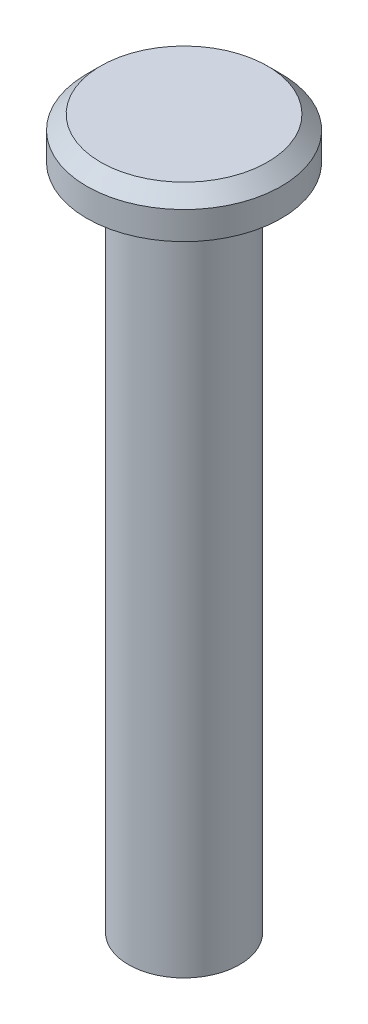
ISO-10303-21;
HEADER;
FILE_DESCRIPTION(('STEP AP214'),'2;1');
FILE_NAME('part.step','',(''),(''),'','','');
FILE_SCHEMA(('AUTOMOTIVE_DESIGN { 1 0 10303 214 1 1 1 1 }'));
ENDSEC;
DATA;
#1=APPLICATION_CONTEXT('core data for automotive mechanical design processes');
#2=APPLICATION_PROTOCOL_DEFINITION('international standard','automotive_design',2000,#1);
#3=PRODUCT_CONTEXT('',#1,'mechanical');
#4=PRODUCT('Part','Part','',(#3));
#5=PRODUCT_RELATED_PRODUCT_CATEGORY('part','',(#4));
#6=PRODUCT_DEFINITION_FORMATION('','',#4);
#7=PRODUCT_DEFINITION_CONTEXT('part definition',#1,'design');
#8=PRODUCT_DEFINITION('design','',#6,#7);
#9=PRODUCT_DEFINITION_SHAPE('','',#8);
#10=(LENGTH_UNIT() NAMED_UNIT(*) SI_UNIT(.MILLI.,.METRE.));
#11=(NAMED_UNIT(*) PLANE_ANGLE_UNIT() SI_UNIT($,.RADIAN.));
#12=(NAMED_UNIT(*) SI_UNIT($,.STERADIAN.) SOLID_ANGLE_UNIT());
#13=UNCERTAINTY_MEASURE_WITH_UNIT(LENGTH_MEASURE(1.E-05),#10,'distance_accuracy_value','');
#14=(GEOMETRIC_REPRESENTATION_CONTEXT(3) GLOBAL_UNCERTAINTY_ASSIGNED_CONTEXT((#13)) GLOBAL_UNIT_ASSIGNED_CONTEXT((#10,
#11,#12)) REPRESENTATION_CONTEXT('',''));
#15=CARTESIAN_POINT('',(0.,0.,0.));
#16=DIRECTION('',(0.,0.,1.));
#17=DIRECTION('',(1.,0.,0.));
#18=AXIS2_PLACEMENT_3D('',#15,#16,#17);
#19=CARTESIAN_POINT('',(0.,3.,0.));
#20=DIRECTION('',(0.,-1.,0.));
#21=DIRECTION('',(0.,0.,-1.));
#22=AXIS2_PLACEMENT_3D('',#19,#20,#21);
#23=CYLINDRICAL_SURFACE('',#22,7.);
#24=CARTESIAN_POINT('',(0.,1.99999999999999,0.));
#25=DIRECTION('',(0.,1.,0.));
#26=DIRECTION('',(0.,0.,1.));
#27=AXIS2_PLACEMENT_3D('',#24,#25,#26);
#28=CIRCLE('',#27,7.);
#29=CARTESIAN_POINT('',(0.,1.99999999999999,7.));
#30=VERTEX_POINT('',#29);
#31=EDGE_CURVE('E10',#30,#30,#28,.F.);
#32=ORIENTED_EDGE('',*,*,#31,.T.);
#33=EDGE_LOOP('',(#32));
#34=FACE_BOUND('',#33,.T.);
#35=CARTESIAN_POINT('',(0.,0.,0.));
#36=DIRECTION('',(0.,1.,0.));
#37=DIRECTION('',(0.,0.,1.));
#38=AXIS2_PLACEMENT_3D('',#35,#36,#37);
#39=CIRCLE('',#38,7.);
#40=CARTESIAN_POINT('',(0.,0.,7.));
#41=VERTEX_POINT('',#40);
#42=EDGE_CURVE('E64',#41,#41,#39,.T.);
#43=ORIENTED_EDGE('',*,*,#42,.T.);
#44=EDGE_LOOP('',(#43));
#45=FACE_BOUND('',#44,.T.);
#46=ADVANCED_FACE('F45',(#34,#45),#23,.T.);
#47=CARTESIAN_POINT('',(0.,3.,0.));
#48=DIRECTION('',(0.,1.,0.));
#49=DIRECTION('',(0.,0.,1.));
#50=AXIS2_PLACEMENT_3D('',#47,#48,#49);
#51=PLANE('',#50);
#52=CARTESIAN_POINT('',(0.,3.,0.));
#53=DIRECTION('',(0.,1.,0.));
#54=DIRECTION('',(0.,0.,1.));
#55=AXIS2_PLACEMENT_3D('',#52,#53,#54);
#56=CIRCLE('',#55,6.);
#57=CARTESIAN_POINT('',(0.,3.,6.));
#58=VERTEX_POINT('',#57);
#59=EDGE_CURVE('E54',#58,#58,#56,.T.);
#60=ORIENTED_EDGE('',*,*,#59,.T.);
#61=EDGE_LOOP('',(#60));
#62=FACE_BOUND('',#61,.T.);
#63=ADVANCED_FACE('F86',(#62),#51,.T.);
#64=CARTESIAN_POINT('',(0.,0.,0.));
#65=DIRECTION('',(0.,1.,0.));
#66=DIRECTION('',(0.,0.,1.));
#67=AXIS2_PLACEMENT_3D('',#64,#65,#66);
#68=PLANE('',#67);
#69=CARTESIAN_POINT('',(0.,0.,0.));
#70=DIRECTION('',(0.,-1.,0.));
#71=DIRECTION('',(0.,0.,-1.));
#72=AXIS2_PLACEMENT_3D('',#69,#70,#71);
#73=CIRCLE('',#72,4.);
#74=CARTESIAN_POINT('',(0.,0.,-4.));
#75=VERTEX_POINT('',#74);
#76=EDGE_CURVE('E59',#75,#75,#73,.T.);
#77=ORIENTED_EDGE('',*,*,#76,.F.);
#78=EDGE_LOOP('',(#77));
#79=FACE_BOUND('',#78,.T.);
#80=ORIENTED_EDGE('',*,*,#42,.F.);
#81=EDGE_LOOP('',(#80));
#82=FACE_BOUND('',#81,.T.);
#83=ADVANCED_FACE('F80',(#79,#82),#68,.F.);
#84=CARTESIAN_POINT('',(0.,-48.,0.));
#85=DIRECTION('',(0.,1.,0.));
#86=DIRECTION('',(0.,0.,1.));
#87=AXIS2_PLACEMENT_3D('',#84,#85,#86);
#88=CYLINDRICAL_SURFACE('',#87,4.);
#89=CARTESIAN_POINT('',(0.,-48.,0.));
#90=DIRECTION('',(0.,-1.,0.));
#91=DIRECTION('',(0.,0.,-1.));
#92=AXIS2_PLACEMENT_3D('',#89,#90,#91);
#93=CIRCLE('',#92,4.);
#94=CARTESIAN_POINT('',(0.,-48.,-4.));
#95=VERTEX_POINT('',#94);
#96=EDGE_CURVE('E69',#95,#95,#93,.T.);
#97=ORIENTED_EDGE('',*,*,#96,.F.);
#98=EDGE_LOOP('',(#97));
#99=FACE_BOUND('',#98,.T.);
#100=ORIENTED_EDGE('',*,*,#76,.T.);
#101=EDGE_LOOP('',(#100));
#102=FACE_BOUND('',#101,.T.);
#103=ADVANCED_FACE('F77',(#99,#102),#88,.T.);
#104=CARTESIAN_POINT('',(0.,-48.,0.));
#105=DIRECTION('',(0.,-1.,0.));
#106=DIRECTION('',(0.,0.,-1.));
#107=AXIS2_PLACEMENT_3D('',#104,#105,#106);
#108=PLANE('',#107);
#109=ORIENTED_EDGE('',*,*,#96,.T.);
#110=EDGE_LOOP('',(#109));
#111=FACE_BOUND('',#110,.T.);
#112=ADVANCED_FACE('F75',(#111),#108,.T.);
#113=CARTESIAN_POINT('',(0.,3.,0.));
#114=DIRECTION('',(0.,-1.,0.));
#115=DIRECTION('',(0.,0.,-1.));
#116=AXIS2_PLACEMENT_3D('',#113,#114,#115);
#117=CONICAL_SURFACE('',#116,6.,0.785398163397447);
#118=ORIENTED_EDGE('',*,*,#31,.F.);
#119=EDGE_LOOP('',(#118));
#120=FACE_BOUND('',#119,.T.);
#121=ORIENTED_EDGE('',*,*,#59,.F.);
#122=EDGE_LOOP('',(#121));
#123=FACE_BOUND('',#122,.T.);
#124=ADVANCED_FACE('F48',(#120,#123),#117,.T.);
#125=CLOSED_SHELL('',(#46,#63,#83,#103,#112,#124));
#126=MANIFOLD_SOLID_BREP('B2',#125);
#127=ADVANCED_BREP_SHAPE_REPRESENTATION('',(#18,#126),#14);
#128=SHAPE_DEFINITION_REPRESENTATION(#9,#127);
ENDSEC;
END-ISO-10303-21;
